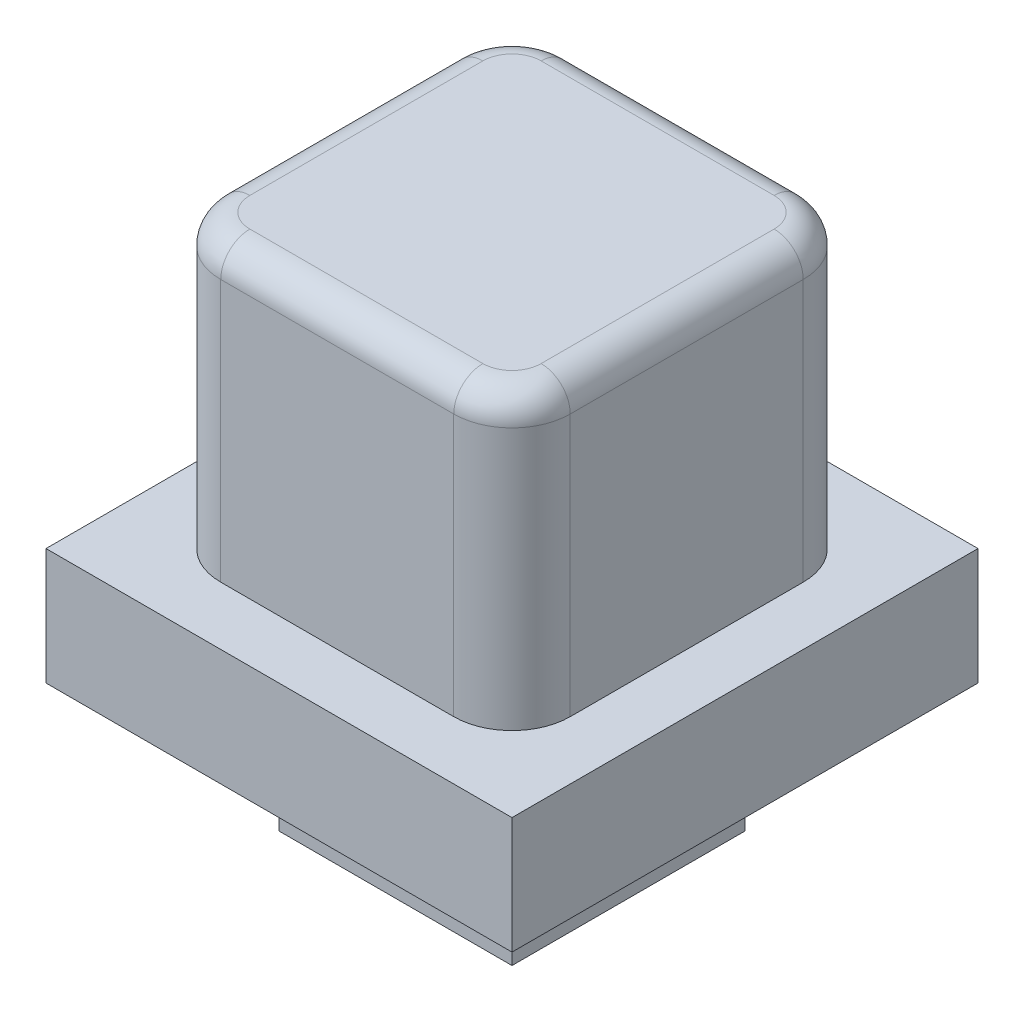
ISO-10303-21;
HEADER;
FILE_DESCRIPTION(('STEP AP214'),'2;1');
FILE_NAME('part.step','',(''),(''),'','','');
FILE_SCHEMA(('AUTOMOTIVE_DESIGN { 1 0 10303 214 1 1 1 1 }'));
ENDSEC;
DATA;
#1=APPLICATION_CONTEXT('core data for automotive mechanical design processes');
#2=APPLICATION_PROTOCOL_DEFINITION('international standard','automotive_design',2000,#1);
#3=PRODUCT_CONTEXT('',#1,'mechanical');
#4=PRODUCT('Part','Part','',(#3));
#5=PRODUCT_RELATED_PRODUCT_CATEGORY('part','',(#4));
#6=PRODUCT_DEFINITION_FORMATION('','',#4);
#7=PRODUCT_DEFINITION_CONTEXT('part definition',#1,'design');
#8=PRODUCT_DEFINITION('design','',#6,#7);
#9=PRODUCT_DEFINITION_SHAPE('','',#8);
#10=(LENGTH_UNIT() NAMED_UNIT(*) SI_UNIT(.MILLI.,.METRE.));
#11=(NAMED_UNIT(*) PLANE_ANGLE_UNIT() SI_UNIT($,.RADIAN.));
#12=(NAMED_UNIT(*) SI_UNIT($,.STERADIAN.) SOLID_ANGLE_UNIT());
#13=UNCERTAINTY_MEASURE_WITH_UNIT(LENGTH_MEASURE(1.E-05),#10,'distance_accuracy_value','');
#14=(GEOMETRIC_REPRESENTATION_CONTEXT(3) GLOBAL_UNCERTAINTY_ASSIGNED_CONTEXT((#13)) GLOBAL_UNIT_ASSIGNED_CONTEXT((#10,
#11,#12)) REPRESENTATION_CONTEXT('',''));
#15=CARTESIAN_POINT('',(0.,0.,0.));
#16=DIRECTION('',(0.,0.,1.));
#17=DIRECTION('',(1.,0.,0.));
#18=AXIS2_PLACEMENT_3D('',#15,#16,#17);
#19=CARTESIAN_POINT('',(0.,2.,0.));
#20=DIRECTION('',(0.,-1.,0.));
#21=DIRECTION('',(0.,0.,-1.));
#22=AXIS2_PLACEMENT_3D('',#19,#20,#21);
#23=PLANE('',#22);
#24=DIRECTION('',(0.,0.,-1.));
#25=VECTOR('',#24,1.);
#26=CARTESIAN_POINT('',(4.,2.,4.));
#27=LINE('',#26,#25);
#28=CARTESIAN_POINT('',(4.,2.,4.));
#29=VERTEX_POINT('',#28);
#30=CARTESIAN_POINT('',(4.,2.,-4.));
#31=VERTEX_POINT('',#30);
#32=EDGE_CURVE('E221',#29,#31,#27,.T.);
#33=ORIENTED_EDGE('',*,*,#32,.T.);
#34=DIRECTION('',(-1.,0.,0.));
#35=VECTOR('',#34,1.);
#36=CARTESIAN_POINT('',(-4.,2.,-4.));
#37=LINE('',#36,#35);
#38=CARTESIAN_POINT('',(-4.,2.,-4.));
#39=VERTEX_POINT('',#38);
#40=EDGE_CURVE('E224',#31,#39,#37,.T.);
#41=ORIENTED_EDGE('',*,*,#40,.T.);
#42=DIRECTION('',(0.,0.,1.));
#43=VECTOR('',#42,1.);
#44=CARTESIAN_POINT('',(-4.,2.,4.));
#45=LINE('',#44,#43);
#46=CARTESIAN_POINT('',(-4.,2.,4.));
#47=VERTEX_POINT('',#46);
#48=EDGE_CURVE('E227',#39,#47,#45,.T.);
#49=ORIENTED_EDGE('',*,*,#48,.T.);
#50=DIRECTION('',(1.,0.,0.));
#51=VECTOR('',#50,1.);
#52=CARTESIAN_POINT('',(-4.,2.,4.));
#53=LINE('',#52,#51);
#54=EDGE_CURVE('E229',#47,#29,#53,.T.);
#55=ORIENTED_EDGE('',*,*,#54,.T.);
#56=EDGE_LOOP('',(#33,#41,#49,#55));
#57=FACE_BOUND('',#56,.T.);
#58=DIRECTION('',(0.,0.,-1.));
#59=VECTOR('',#58,1.);
#60=CARTESIAN_POINT('',(3.,2.,3.));
#61=LINE('',#60,#59);
#62=CARTESIAN_POINT('',(3.,2.,2.));
#63=VERTEX_POINT('',#62);
#64=CARTESIAN_POINT('',(3.,2.,-2.));
#65=VERTEX_POINT('',#64);
#66=EDGE_CURVE('E203',#63,#65,#61,.T.);
#67=ORIENTED_EDGE('',*,*,#66,.F.);
#68=CARTESIAN_POINT('',(2.,2.,2.));
#69=DIRECTION('',(0.,-1.,0.));
#70=DIRECTION('',(0.,0.,-1.));
#71=AXIS2_PLACEMENT_3D('',#68,#69,#70);
#72=CIRCLE('',#71,1.);
#73=CARTESIAN_POINT('',(2.,2.,3.));
#74=VERTEX_POINT('',#73);
#75=EDGE_CURVE('E268',#63,#74,#72,.T.);
#76=ORIENTED_EDGE('',*,*,#75,.T.);
#77=DIRECTION('',(1.,0.,0.));
#78=VECTOR('',#77,1.);
#79=CARTESIAN_POINT('',(-3.,2.,3.));
#80=LINE('',#79,#78);
#81=CARTESIAN_POINT('',(-2.,2.,3.));
#82=VERTEX_POINT('',#81);
#83=EDGE_CURVE('E217',#82,#74,#80,.T.);
#84=ORIENTED_EDGE('',*,*,#83,.F.);
#85=CARTESIAN_POINT('',(-2.,2.,2.));
#86=DIRECTION('',(0.,-1.,0.));
#87=DIRECTION('',(0.,0.,-1.));
#88=AXIS2_PLACEMENT_3D('',#85,#86,#87);
#89=CIRCLE('',#88,1.);
#90=CARTESIAN_POINT('',(-3.,2.,2.));
#91=VERTEX_POINT('',#90);
#92=EDGE_CURVE('E272',#82,#91,#89,.T.);
#93=ORIENTED_EDGE('',*,*,#92,.T.);
#94=DIRECTION('',(0.,0.,1.));
#95=VECTOR('',#94,1.);
#96=CARTESIAN_POINT('',(-3.,2.,3.));
#97=LINE('',#96,#95);
#98=CARTESIAN_POINT('',(-3.,2.,-2.));
#99=VERTEX_POINT('',#98);
#100=EDGE_CURVE('E214',#99,#91,#97,.T.);
#101=ORIENTED_EDGE('',*,*,#100,.F.);
#102=CARTESIAN_POINT('',(-2.,2.,-2.));
#103=DIRECTION('',(0.,-1.,0.));
#104=DIRECTION('',(0.,0.,-1.));
#105=AXIS2_PLACEMENT_3D('',#102,#103,#104);
#106=CIRCLE('',#105,1.);
#107=CARTESIAN_POINT('',(-2.,2.,-3.));
#108=VERTEX_POINT('',#107);
#109=EDGE_CURVE('E274',#99,#108,#106,.T.);
#110=ORIENTED_EDGE('',*,*,#109,.T.);
#111=DIRECTION('',(-1.,0.,0.));
#112=VECTOR('',#111,1.);
#113=CARTESIAN_POINT('',(-3.,2.,-3.));
#114=LINE('',#113,#112);
#115=CARTESIAN_POINT('',(2.,2.,-3.));
#116=VERTEX_POINT('',#115);
#117=EDGE_CURVE('E206',#116,#108,#114,.T.);
#118=ORIENTED_EDGE('',*,*,#117,.F.);
#119=CARTESIAN_POINT('',(2.,2.,-2.));
#120=DIRECTION('',(0.,-1.,0.));
#121=DIRECTION('',(0.,0.,-1.));
#122=AXIS2_PLACEMENT_3D('',#119,#120,#121);
#123=CIRCLE('',#122,1.);
#124=EDGE_CURVE('E270',#116,#65,#123,.T.);
#125=ORIENTED_EDGE('',*,*,#124,.T.);
#126=EDGE_LOOP('',(#67,#76,#84,#93,#101,#110,#118,#125));
#127=FACE_BOUND('',#126,.T.);
#128=ADVANCED_FACE('F39',(#57,#127),#23,.F.);
#129=CARTESIAN_POINT('',(4.,2.,4.));
#130=DIRECTION('',(-1.,0.,0.));
#131=DIRECTION('',(0.,0.,1.));
#132=AXIS2_PLACEMENT_3D('',#129,#130,#131);
#133=PLANE('',#132);
#134=DIRECTION('',(0.,0.,-1.));
#135=VECTOR('',#134,1.);
#136=CARTESIAN_POINT('',(4.,0.,4.));
#137=LINE('',#136,#135);
#138=CARTESIAN_POINT('',(4.,0.,4.));
#139=VERTEX_POINT('',#138);
#140=CARTESIAN_POINT('',(4.,0.,-4.));
#141=VERTEX_POINT('',#140);
#142=EDGE_CURVE('E220',#139,#141,#137,.T.);
#143=ORIENTED_EDGE('',*,*,#142,.T.);
#144=DIRECTION('',(0.,-1.,0.));
#145=VECTOR('',#144,1.);
#146=CARTESIAN_POINT('',(4.,2.,-4.));
#147=LINE('',#146,#145);
#148=EDGE_CURVE('E247',#31,#141,#147,.T.);
#149=ORIENTED_EDGE('',*,*,#148,.F.);
#150=ORIENTED_EDGE('',*,*,#32,.F.);
#151=DIRECTION('',(0.,-1.,0.));
#152=VECTOR('',#151,1.);
#153=CARTESIAN_POINT('',(4.,2.,4.));
#154=LINE('',#153,#152);
#155=EDGE_CURVE('E231',#29,#139,#154,.T.);
#156=ORIENTED_EDGE('',*,*,#155,.T.);
#157=EDGE_LOOP('',(#143,#149,#150,#156));
#158=FACE_BOUND('',#157,.T.);
#159=ADVANCED_FACE('F361',(#158),#133,.F.);
#160=CARTESIAN_POINT('',(-4.,2.,-4.));
#161=DIRECTION('',(0.,0.,1.));
#162=DIRECTION('',(1.,0.,0.));
#163=AXIS2_PLACEMENT_3D('',#160,#161,#162);
#164=PLANE('',#163);
#165=DIRECTION('',(-1.,0.,0.));
#166=VECTOR('',#165,1.);
#167=CARTESIAN_POINT('',(-4.,0.,-4.));
#168=LINE('',#167,#166);
#169=CARTESIAN_POINT('',(-4.,0.,-4.));
#170=VERTEX_POINT('',#169);
#171=EDGE_CURVE('E234',#141,#170,#168,.T.);
#172=ORIENTED_EDGE('',*,*,#171,.T.);
#173=DIRECTION('',(0.,-1.,0.));
#174=VECTOR('',#173,1.);
#175=CARTESIAN_POINT('',(-4.,2.,-4.));
#176=LINE('',#175,#174);
#177=EDGE_CURVE('E244',#39,#170,#176,.T.);
#178=ORIENTED_EDGE('',*,*,#177,.F.);
#179=ORIENTED_EDGE('',*,*,#40,.F.);
#180=ORIENTED_EDGE('',*,*,#148,.T.);
#181=EDGE_LOOP('',(#172,#178,#179,#180));
#182=FACE_BOUND('',#181,.T.);
#183=ADVANCED_FACE('F372',(#182),#164,.F.);
#184=CARTESIAN_POINT('',(-4.,2.,4.));
#185=DIRECTION('',(1.,0.,0.));
#186=DIRECTION('',(0.,0.,-1.));
#187=AXIS2_PLACEMENT_3D('',#184,#185,#186);
#188=PLANE('',#187);
#189=DIRECTION('',(0.,0.,1.));
#190=VECTOR('',#189,1.);
#191=CARTESIAN_POINT('',(-4.,0.,4.));
#192=LINE('',#191,#190);
#193=CARTESIAN_POINT('',(-4.,0.,4.));
#194=VERTEX_POINT('',#193);
#195=EDGE_CURVE('E236',#170,#194,#192,.T.);
#196=ORIENTED_EDGE('',*,*,#195,.T.);
#197=DIRECTION('',(0.,-1.,0.));
#198=VECTOR('',#197,1.);
#199=CARTESIAN_POINT('',(-4.,2.,4.));
#200=LINE('',#199,#198);
#201=EDGE_CURVE('E241',#47,#194,#200,.T.);
#202=ORIENTED_EDGE('',*,*,#201,.F.);
#203=ORIENTED_EDGE('',*,*,#48,.F.);
#204=ORIENTED_EDGE('',*,*,#177,.T.);
#205=EDGE_LOOP('',(#196,#202,#203,#204));
#206=FACE_BOUND('',#205,.T.);
#207=ADVANCED_FACE('F369',(#206),#188,.F.);
#208=CARTESIAN_POINT('',(-4.,2.,4.));
#209=DIRECTION('',(0.,0.,-1.));
#210=DIRECTION('',(-1.,0.,0.));
#211=AXIS2_PLACEMENT_3D('',#208,#209,#210);
#212=PLANE('',#211);
#213=DIRECTION('',(1.,0.,0.));
#214=VECTOR('',#213,1.);
#215=CARTESIAN_POINT('',(-4.,0.,4.));
#216=LINE('',#215,#214);
#217=EDGE_CURVE('E225',#194,#139,#216,.T.);
#218=ORIENTED_EDGE('',*,*,#217,.T.);
#219=ORIENTED_EDGE('',*,*,#155,.F.);
#220=ORIENTED_EDGE('',*,*,#54,.F.);
#221=ORIENTED_EDGE('',*,*,#201,.T.);
#222=EDGE_LOOP('',(#218,#219,#220,#221));
#223=FACE_BOUND('',#222,.T.);
#224=ADVANCED_FACE('F354',(#223),#212,.F.);
#225=CARTESIAN_POINT('',(0.,0.,0.));
#226=DIRECTION('',(0.,-1.,0.));
#227=DIRECTION('',(0.,0.,-1.));
#228=AXIS2_PLACEMENT_3D('',#225,#226,#227);
#229=PLANE('',#228);
#230=DIRECTION('',(0.,0.,-1.));
#231=VECTOR('',#230,1.);
#232=CARTESIAN_POINT('',(-2.,0.,2.));
#233=LINE('',#232,#231);
#234=CARTESIAN_POINT('',(-2.,0.,2.));
#235=VERTEX_POINT('',#234);
#236=CARTESIAN_POINT('',(-2.,0.,-2.));
#237=VERTEX_POINT('',#236);
#238=EDGE_CURVE('E202',#235,#237,#233,.T.);
#239=ORIENTED_EDGE('',*,*,#238,.F.);
#240=DIRECTION('',(-1.,0.,0.));
#241=VECTOR('',#240,1.);
#242=CARTESIAN_POINT('',(2.,0.,2.));
#243=LINE('',#242,#241);
#244=CARTESIAN_POINT('',(2.,0.,2.));
#245=VERTEX_POINT('',#244);
#246=EDGE_CURVE('E199',#245,#235,#243,.T.);
#247=ORIENTED_EDGE('',*,*,#246,.F.);
#248=DIRECTION('',(0.,0.,1.));
#249=VECTOR('',#248,1.);
#250=CARTESIAN_POINT('',(2.,0.,2.));
#251=LINE('',#250,#249);
#252=CARTESIAN_POINT('',(2.,0.,-2.));
#253=VERTEX_POINT('',#252);
#254=EDGE_CURVE('E333',#253,#245,#251,.T.);
#255=ORIENTED_EDGE('',*,*,#254,.F.);
#256=DIRECTION('',(1.,0.,0.));
#257=VECTOR('',#256,1.);
#258=CARTESIAN_POINT('',(2.,0.,-2.));
#259=LINE('',#258,#257);
#260=EDGE_CURVE('E331',#237,#253,#259,.T.);
#261=ORIENTED_EDGE('',*,*,#260,.F.);
#262=EDGE_LOOP('',(#239,#247,#255,#261));
#263=FACE_BOUND('',#262,.T.);
#264=ORIENTED_EDGE('',*,*,#142,.F.);
#265=ORIENTED_EDGE('',*,*,#217,.F.);
#266=ORIENTED_EDGE('',*,*,#195,.F.);
#267=ORIENTED_EDGE('',*,*,#171,.F.);
#268=EDGE_LOOP('',(#264,#265,#266,#267));
#269=FACE_BOUND('',#268,.T.);
#270=ADVANCED_FACE('F350',(#263,#269),#229,.T.);
#271=CARTESIAN_POINT('',(3.,7.,3.));
#272=DIRECTION('',(-1.,0.,0.));
#273=DIRECTION('',(0.,0.,1.));
#274=AXIS2_PLACEMENT_3D('',#271,#272,#273);
#275=PLANE('',#274);
#276=DIRECTION('',(0.,-1.,0.));
#277=VECTOR('',#276,1.);
#278=CARTESIAN_POINT('',(3.,7.,-2.));
#279=LINE('',#278,#277);
#280=CARTESIAN_POINT('',(3.,6.5,-2.));
#281=VERTEX_POINT('',#280);
#282=EDGE_CURVE('E250',#65,#281,#279,.F.);
#283=ORIENTED_EDGE('',*,*,#282,.T.);
#284=DIRECTION('',(0.,0.,-1.));
#285=VECTOR('',#284,1.);
#286=CARTESIAN_POINT('',(3.,6.5,3.));
#287=LINE('',#286,#285);
#288=CARTESIAN_POINT('',(3.,6.5,2.));
#289=VERTEX_POINT('',#288);
#290=EDGE_CURVE('E296',#281,#289,#287,.F.);
#291=ORIENTED_EDGE('',*,*,#290,.T.);
#292=DIRECTION('',(0.,-1.,0.));
#293=VECTOR('',#292,1.);
#294=CARTESIAN_POINT('',(3.,7.,2.));
#295=LINE('',#294,#293);
#296=EDGE_CURVE('E253',#289,#63,#295,.T.);
#297=ORIENTED_EDGE('',*,*,#296,.T.);
#298=ORIENTED_EDGE('',*,*,#66,.T.);
#299=EDGE_LOOP('',(#283,#291,#297,#298));
#300=FACE_BOUND('',#299,.T.);
#301=ADVANCED_FACE('F353',(#300),#275,.F.);
#302=CARTESIAN_POINT('',(-3.,7.,-3.));
#303=DIRECTION('',(0.,0.,1.));
#304=DIRECTION('',(1.,0.,0.));
#305=AXIS2_PLACEMENT_3D('',#302,#303,#304);
#306=PLANE('',#305);
#307=DIRECTION('',(0.,-1.,0.));
#308=VECTOR('',#307,1.);
#309=CARTESIAN_POINT('',(-2.,7.,-3.));
#310=LINE('',#309,#308);
#311=CARTESIAN_POINT('',(-2.,6.5,-3.));
#312=VERTEX_POINT('',#311);
#313=EDGE_CURVE('E260',#108,#312,#310,.F.);
#314=ORIENTED_EDGE('',*,*,#313,.T.);
#315=DIRECTION('',(-1.,0.,0.));
#316=VECTOR('',#315,1.);
#317=CARTESIAN_POINT('',(-3.,6.5,-3.));
#318=LINE('',#317,#316);
#319=CARTESIAN_POINT('',(2.,6.5,-3.));
#320=VERTEX_POINT('',#319);
#321=EDGE_CURVE('E11',#312,#320,#318,.F.);
#322=ORIENTED_EDGE('',*,*,#321,.T.);
#323=DIRECTION('',(0.,-1.,0.));
#324=VECTOR('',#323,1.);
#325=CARTESIAN_POINT('',(2.,7.,-3.));
#326=LINE('',#325,#324);
#327=EDGE_CURVE('E262',#320,#116,#326,.T.);
#328=ORIENTED_EDGE('',*,*,#327,.T.);
#329=ORIENTED_EDGE('',*,*,#117,.T.);
#330=EDGE_LOOP('',(#314,#322,#328,#329));
#331=FACE_BOUND('',#330,.T.);
#332=ADVANCED_FACE('F468',(#331),#306,.F.);
#333=CARTESIAN_POINT('',(-3.,7.,3.));
#334=DIRECTION('',(1.,0.,0.));
#335=DIRECTION('',(0.,0.,-1.));
#336=AXIS2_PLACEMENT_3D('',#333,#334,#335);
#337=PLANE('',#336);
#338=DIRECTION('',(0.,-1.,0.));
#339=VECTOR('',#338,1.);
#340=CARTESIAN_POINT('',(-3.,7.,2.));
#341=LINE('',#340,#339);
#342=CARTESIAN_POINT('',(-3.,6.5,2.));
#343=VERTEX_POINT('',#342);
#344=EDGE_CURVE('E266',#91,#343,#341,.F.);
#345=ORIENTED_EDGE('',*,*,#344,.T.);
#346=DIRECTION('',(0.,0.,1.));
#347=VECTOR('',#346,1.);
#348=CARTESIAN_POINT('',(-3.,6.5,3.));
#349=LINE('',#348,#347);
#350=CARTESIAN_POINT('',(-3.,6.5,-2.));
#351=VERTEX_POINT('',#350);
#352=EDGE_CURVE('E63',#343,#351,#349,.F.);
#353=ORIENTED_EDGE('',*,*,#352,.T.);
#354=DIRECTION('',(0.,-1.,0.));
#355=VECTOR('',#354,1.);
#356=CARTESIAN_POINT('',(-3.,7.,-2.));
#357=LINE('',#356,#355);
#358=EDGE_CURVE('E264',#351,#99,#357,.T.);
#359=ORIENTED_EDGE('',*,*,#358,.T.);
#360=ORIENTED_EDGE('',*,*,#100,.T.);
#361=EDGE_LOOP('',(#345,#353,#359,#360));
#362=FACE_BOUND('',#361,.T.);
#363=ADVANCED_FACE('F465',(#362),#337,.F.);
#364=CARTESIAN_POINT('',(-3.,7.,3.));
#365=DIRECTION('',(0.,0.,-1.));
#366=DIRECTION('',(-1.,0.,0.));
#367=AXIS2_PLACEMENT_3D('',#364,#365,#366);
#368=PLANE('',#367);
#369=DIRECTION('',(0.,-1.,0.));
#370=VECTOR('',#369,1.);
#371=CARTESIAN_POINT('',(2.,7.,3.));
#372=LINE('',#371,#370);
#373=CARTESIAN_POINT('',(2.,6.5,3.));
#374=VERTEX_POINT('',#373);
#375=EDGE_CURVE('E257',#74,#374,#372,.F.);
#376=ORIENTED_EDGE('',*,*,#375,.T.);
#377=DIRECTION('',(1.,0.,0.));
#378=VECTOR('',#377,1.);
#379=CARTESIAN_POINT('',(-3.,6.5,3.));
#380=LINE('',#379,#378);
#381=CARTESIAN_POINT('',(-2.,6.5,3.));
#382=VERTEX_POINT('',#381);
#383=EDGE_CURVE('E300',#374,#382,#380,.F.);
#384=ORIENTED_EDGE('',*,*,#383,.T.);
#385=DIRECTION('',(0.,-1.,0.));
#386=VECTOR('',#385,1.);
#387=CARTESIAN_POINT('',(-2.,7.,3.));
#388=LINE('',#387,#386);
#389=EDGE_CURVE('E255',#382,#82,#388,.T.);
#390=ORIENTED_EDGE('',*,*,#389,.T.);
#391=ORIENTED_EDGE('',*,*,#83,.T.);
#392=EDGE_LOOP('',(#376,#384,#390,#391));
#393=FACE_BOUND('',#392,.T.);
#394=ADVANCED_FACE('F418',(#393),#368,.F.);
#395=CARTESIAN_POINT('',(0.,7.,0.));
#396=DIRECTION('',(0.,-1.,0.));
#397=DIRECTION('',(0.,0.,-1.));
#398=AXIS2_PLACEMENT_3D('',#395,#396,#397);
#399=PLANE('',#398);
#400=DIRECTION('',(0.,0.,-1.));
#401=VECTOR('',#400,1.);
#402=CARTESIAN_POINT('',(2.5,7.,0.));
#403=LINE('',#402,#401);
#404=CARTESIAN_POINT('',(2.5,7.,2.));
#405=VERTEX_POINT('',#404);
#406=CARTESIAN_POINT('',(2.5,7.,-2.));
#407=VERTEX_POINT('',#406);
#408=EDGE_CURVE('E288',#405,#407,#403,.T.);
#409=ORIENTED_EDGE('',*,*,#408,.T.);
#410=CARTESIAN_POINT('',(2.,7.,-2.));
#411=DIRECTION('',(0.,-1.,0.));
#412=DIRECTION('',(0.,0.,-1.));
#413=AXIS2_PLACEMENT_3D('',#410,#411,#412);
#414=CIRCLE('',#413,0.5);
#415=CARTESIAN_POINT('',(2.,7.,-2.5));
#416=VERTEX_POINT('',#415);
#417=EDGE_CURVE('E290',#407,#416,#414,.F.);
#418=ORIENTED_EDGE('',*,*,#417,.T.);
#419=DIRECTION('',(-1.,0.,0.));
#420=VECTOR('',#419,1.);
#421=CARTESIAN_POINT('',(0.,7.,-2.5));
#422=LINE('',#421,#420);
#423=CARTESIAN_POINT('',(-2.,7.,-2.5));
#424=VERTEX_POINT('',#423);
#425=EDGE_CURVE('E276',#416,#424,#422,.T.);
#426=ORIENTED_EDGE('',*,*,#425,.T.);
#427=CARTESIAN_POINT('',(-2.,7.,-2.));
#428=DIRECTION('',(0.,-1.,0.));
#429=DIRECTION('',(0.,0.,-1.));
#430=AXIS2_PLACEMENT_3D('',#427,#428,#429);
#431=CIRCLE('',#430,0.5);
#432=CARTESIAN_POINT('',(-2.5,7.,-2.));
#433=VERTEX_POINT('',#432);
#434=EDGE_CURVE('E278',#424,#433,#431,.F.);
#435=ORIENTED_EDGE('',*,*,#434,.T.);
#436=DIRECTION('',(0.,0.,1.));
#437=VECTOR('',#436,1.);
#438=CARTESIAN_POINT('',(-2.5,7.,0.));
#439=LINE('',#438,#437);
#440=CARTESIAN_POINT('',(-2.5,7.,2.));
#441=VERTEX_POINT('',#440);
#442=EDGE_CURVE('E280',#433,#441,#439,.T.);
#443=ORIENTED_EDGE('',*,*,#442,.T.);
#444=CARTESIAN_POINT('',(-2.,7.,2.));
#445=DIRECTION('',(0.,-1.,0.));
#446=DIRECTION('',(0.,0.,-1.));
#447=AXIS2_PLACEMENT_3D('',#444,#445,#446);
#448=CIRCLE('',#447,0.5);
#449=CARTESIAN_POINT('',(-2.,7.,2.5));
#450=VERTEX_POINT('',#449);
#451=EDGE_CURVE('E282',#441,#450,#448,.F.);
#452=ORIENTED_EDGE('',*,*,#451,.T.);
#453=DIRECTION('',(1.,0.,0.));
#454=VECTOR('',#453,1.);
#455=CARTESIAN_POINT('',(0.,7.,2.5));
#456=LINE('',#455,#454);
#457=CARTESIAN_POINT('',(2.,7.,2.5));
#458=VERTEX_POINT('',#457);
#459=EDGE_CURVE('E284',#450,#458,#456,.T.);
#460=ORIENTED_EDGE('',*,*,#459,.T.);
#461=CARTESIAN_POINT('',(2.,7.,2.));
#462=DIRECTION('',(0.,-1.,0.));
#463=DIRECTION('',(0.,0.,-1.));
#464=AXIS2_PLACEMENT_3D('',#461,#462,#463);
#465=CIRCLE('',#464,0.5);
#466=EDGE_CURVE('E286',#458,#405,#465,.F.);
#467=ORIENTED_EDGE('',*,*,#466,.T.);
#468=EDGE_LOOP('',(#409,#418,#426,#435,#443,#452,#460,#467));
#469=FACE_BOUND('',#468,.T.);
#470=ADVANCED_FACE('F402',(#469),#399,.F.);
#471=CARTESIAN_POINT('',(2.,7.,2.));
#472=DIRECTION('',(0.,-1.,0.));
#473=DIRECTION('',(0.,0.,-1.));
#474=AXIS2_PLACEMENT_3D('',#471,#472,#473);
#475=CYLINDRICAL_SURFACE('',#474,1.);
#476=ORIENTED_EDGE('',*,*,#296,.F.);
#477=CARTESIAN_POINT('',(2.,6.5,2.));
#478=DIRECTION('',(0.,-1.,0.));
#479=DIRECTION('',(0.,0.,-1.));
#480=AXIS2_PLACEMENT_3D('',#477,#478,#479);
#481=CIRCLE('',#480,1.);
#482=EDGE_CURVE('E298',#289,#374,#481,.T.);
#483=ORIENTED_EDGE('',*,*,#482,.T.);
#484=ORIENTED_EDGE('',*,*,#375,.F.);
#485=ORIENTED_EDGE('',*,*,#75,.F.);
#486=EDGE_LOOP('',(#476,#483,#484,#485));
#487=FACE_BOUND('',#486,.T.);
#488=ADVANCED_FACE('F410',(#487),#475,.T.);
#489=CARTESIAN_POINT('',(2.,7.,-2.));
#490=DIRECTION('',(0.,-1.,0.));
#491=DIRECTION('',(0.,0.,-1.));
#492=AXIS2_PLACEMENT_3D('',#489,#490,#491);
#493=CYLINDRICAL_SURFACE('',#492,1.);
#494=ORIENTED_EDGE('',*,*,#327,.F.);
#495=CARTESIAN_POINT('',(2.,6.5,-2.));
#496=DIRECTION('',(0.,-1.,0.));
#497=DIRECTION('',(0.,0.,-1.));
#498=AXIS2_PLACEMENT_3D('',#495,#496,#497);
#499=CIRCLE('',#498,1.);
#500=EDGE_CURVE('E293',#320,#281,#499,.T.);
#501=ORIENTED_EDGE('',*,*,#500,.T.);
#502=ORIENTED_EDGE('',*,*,#282,.F.);
#503=ORIENTED_EDGE('',*,*,#124,.F.);
#504=EDGE_LOOP('',(#494,#501,#502,#503));
#505=FACE_BOUND('',#504,.T.);
#506=ADVANCED_FACE('F387',(#505),#493,.T.);
#507=CARTESIAN_POINT('',(-2.,7.,2.));
#508=DIRECTION('',(0.,-1.,0.));
#509=DIRECTION('',(0.,0.,-1.));
#510=AXIS2_PLACEMENT_3D('',#507,#508,#509);
#511=CYLINDRICAL_SURFACE('',#510,1.);
#512=ORIENTED_EDGE('',*,*,#389,.F.);
#513=CARTESIAN_POINT('',(-2.,6.5,2.));
#514=DIRECTION('',(0.,-1.,0.));
#515=DIRECTION('',(0.,0.,-1.));
#516=AXIS2_PLACEMENT_3D('',#513,#514,#515);
#517=CIRCLE('',#516,1.);
#518=EDGE_CURVE('E302',#382,#343,#517,.T.);
#519=ORIENTED_EDGE('',*,*,#518,.T.);
#520=ORIENTED_EDGE('',*,*,#344,.F.);
#521=ORIENTED_EDGE('',*,*,#92,.F.);
#522=EDGE_LOOP('',(#512,#519,#520,#521));
#523=FACE_BOUND('',#522,.T.);
#524=ADVANCED_FACE('F422',(#523),#511,.T.);
#525=CARTESIAN_POINT('',(-2.,7.,-2.));
#526=DIRECTION('',(0.,-1.,0.));
#527=DIRECTION('',(0.,0.,-1.));
#528=AXIS2_PLACEMENT_3D('',#525,#526,#527);
#529=CYLINDRICAL_SURFACE('',#528,1.);
#530=ORIENTED_EDGE('',*,*,#358,.F.);
#531=CARTESIAN_POINT('',(-2.,6.5,-2.));
#532=DIRECTION('',(0.,-1.,0.));
#533=DIRECTION('',(0.,0.,-1.));
#534=AXIS2_PLACEMENT_3D('',#531,#532,#533);
#535=CIRCLE('',#534,1.);
#536=EDGE_CURVE('E48',#351,#312,#535,.T.);
#537=ORIENTED_EDGE('',*,*,#536,.T.);
#538=ORIENTED_EDGE('',*,*,#313,.F.);
#539=ORIENTED_EDGE('',*,*,#109,.F.);
#540=EDGE_LOOP('',(#530,#537,#538,#539));
#541=FACE_BOUND('',#540,.T.);
#542=ADVANCED_FACE('F460',(#541),#529,.T.);
#543=CARTESIAN_POINT('',(-2.,-2.2,2.));
#544=DIRECTION('',(1.,0.,0.));
#545=DIRECTION('',(0.,0.,-1.));
#546=AXIS2_PLACEMENT_3D('',#543,#544,#545);
#547=PLANE('',#546);
#548=ORIENTED_EDGE('',*,*,#238,.T.);
#549=DIRECTION('',(0.,1.,0.));
#550=VECTOR('',#549,1.);
#551=CARTESIAN_POINT('',(-2.,-2.2,-2.));
#552=LINE('',#551,#550);
#553=CARTESIAN_POINT('',(-2.,-2.2,-2.));
#554=VERTEX_POINT('',#553);
#555=EDGE_CURVE('E183',#554,#237,#552,.T.);
#556=ORIENTED_EDGE('',*,*,#555,.F.);
#557=DIRECTION('',(0.,0.,-1.));
#558=VECTOR('',#557,1.);
#559=CARTESIAN_POINT('',(-2.,-2.2,2.));
#560=LINE('',#559,#558);
#561=CARTESIAN_POINT('',(-2.,-2.2,2.));
#562=VERTEX_POINT('',#561);
#563=EDGE_CURVE('E190',#562,#554,#560,.T.);
#564=ORIENTED_EDGE('',*,*,#563,.F.);
#565=DIRECTION('',(0.,1.,0.));
#566=VECTOR('',#565,1.);
#567=CARTESIAN_POINT('',(-2.,-2.2,2.));
#568=LINE('',#567,#566);
#569=EDGE_CURVE('E342',#562,#235,#568,.T.);
#570=ORIENTED_EDGE('',*,*,#569,.T.);
#571=EDGE_LOOP('',(#548,#556,#564,#570));
#572=FACE_BOUND('',#571,.T.);
#573=ADVANCED_FACE('F201',(#572),#547,.F.);
#574=CARTESIAN_POINT('',(2.,-2.2,-2.));
#575=DIRECTION('',(0.,0.,1.));
#576=DIRECTION('',(1.,0.,0.));
#577=AXIS2_PLACEMENT_3D('',#574,#575,#576);
#578=PLANE('',#577);
#579=ORIENTED_EDGE('',*,*,#260,.T.);
#580=DIRECTION('',(0.,1.,0.));
#581=VECTOR('',#580,1.);
#582=CARTESIAN_POINT('',(2.,-2.2,-2.));
#583=LINE('',#582,#581);
#584=CARTESIAN_POINT('',(2.,-2.2,-2.));
#585=VERTEX_POINT('',#584);
#586=EDGE_CURVE('E186',#585,#253,#583,.T.);
#587=ORIENTED_EDGE('',*,*,#586,.F.);
#588=DIRECTION('',(1.,0.,0.));
#589=VECTOR('',#588,1.);
#590=CARTESIAN_POINT('',(2.,-2.2,-2.));
#591=LINE('',#590,#589);
#592=EDGE_CURVE('E178',#554,#585,#591,.T.);
#593=ORIENTED_EDGE('',*,*,#592,.F.);
#594=ORIENTED_EDGE('',*,*,#555,.T.);
#595=EDGE_LOOP('',(#579,#587,#593,#594));
#596=FACE_BOUND('',#595,.T.);
#597=ADVANCED_FACE('F181',(#596),#578,.F.);
#598=CARTESIAN_POINT('',(2.,-2.2,2.));
#599=DIRECTION('',(-1.,0.,0.));
#600=DIRECTION('',(0.,0.,1.));
#601=AXIS2_PLACEMENT_3D('',#598,#599,#600);
#602=PLANE('',#601);
#603=ORIENTED_EDGE('',*,*,#254,.T.);
#604=DIRECTION('',(0.,1.,0.));
#605=VECTOR('',#604,1.);
#606=CARTESIAN_POINT('',(2.,-2.2,2.));
#607=LINE('',#606,#605);
#608=CARTESIAN_POINT('',(2.,-2.2,2.));
#609=VERTEX_POINT('',#608);
#610=EDGE_CURVE('E208',#609,#245,#607,.T.);
#611=ORIENTED_EDGE('',*,*,#610,.F.);
#612=DIRECTION('',(0.,0.,1.));
#613=VECTOR('',#612,1.);
#614=CARTESIAN_POINT('',(2.,-2.2,2.));
#615=LINE('',#614,#613);
#616=EDGE_CURVE('E189',#585,#609,#615,.T.);
#617=ORIENTED_EDGE('',*,*,#616,.F.);
#618=ORIENTED_EDGE('',*,*,#586,.T.);
#619=EDGE_LOOP('',(#603,#611,#617,#618));
#620=FACE_BOUND('',#619,.T.);
#621=ADVANCED_FACE('F348',(#620),#602,.F.);
#622=CARTESIAN_POINT('',(2.,-2.2,2.));
#623=DIRECTION('',(0.,0.,-1.));
#624=DIRECTION('',(-1.,0.,0.));
#625=AXIS2_PLACEMENT_3D('',#622,#623,#624);
#626=PLANE('',#625);
#627=ORIENTED_EDGE('',*,*,#246,.T.);
#628=ORIENTED_EDGE('',*,*,#569,.F.);
#629=DIRECTION('',(-1.,0.,0.));
#630=VECTOR('',#629,1.);
#631=CARTESIAN_POINT('',(2.,-2.2,2.));
#632=LINE('',#631,#630);
#633=EDGE_CURVE('E195',#609,#562,#632,.T.);
#634=ORIENTED_EDGE('',*,*,#633,.F.);
#635=ORIENTED_EDGE('',*,*,#610,.T.);
#636=EDGE_LOOP('',(#627,#628,#634,#635));
#637=FACE_BOUND('',#636,.T.);
#638=ADVANCED_FACE('F346',(#637),#626,.F.);
#639=CARTESIAN_POINT('',(0.,-2.2,0.));
#640=DIRECTION('',(0.,1.,0.));
#641=DIRECTION('',(0.,0.,1.));
#642=AXIS2_PLACEMENT_3D('',#639,#640,#641);
#643=PLANE('',#642);
#644=ORIENTED_EDGE('',*,*,#563,.T.);
#645=ORIENTED_EDGE('',*,*,#592,.T.);
#646=ORIENTED_EDGE('',*,*,#616,.T.);
#647=ORIENTED_EDGE('',*,*,#633,.T.);
#648=EDGE_LOOP('',(#644,#645,#646,#647));
#649=FACE_BOUND('',#648,.T.);
#650=ADVANCED_FACE('F193',(#649),#643,.F.);
#651=CARTESIAN_POINT('',(-2.,6.5,2.));
#652=DIRECTION('',(0.,-1.,0.));
#653=DIRECTION('',(0.,0.,-1.));
#654=AXIS2_PLACEMENT_3D('',#651,#652,#653);
#655=DEGENERATE_TOROIDAL_SURFACE('',#654,0.5,0.5,.T.);
#656=CARTESIAN_POINT('',(-2.5,6.5,2.));
#657=DIRECTION('',(0.,0.,-1.));
#658=DIRECTION('',(-1.,0.,0.));
#659=AXIS2_PLACEMENT_3D('',#656,#657,#658);
#660=CIRCLE('',#659,0.5);
#661=EDGE_CURVE('E321',#343,#441,#660,.T.);
#662=ORIENTED_EDGE('',*,*,#661,.F.);
#663=ORIENTED_EDGE('',*,*,#518,.F.);
#664=CARTESIAN_POINT('',(-2.,6.5,2.5));
#665=DIRECTION('',(1.,0.,0.));
#666=DIRECTION('',(0.,0.,-1.));
#667=AXIS2_PLACEMENT_3D('',#664,#665,#666);
#668=CIRCLE('',#667,0.5);
#669=EDGE_CURVE('E43',#450,#382,#668,.T.);
#670=ORIENTED_EDGE('',*,*,#669,.F.);
#671=ORIENTED_EDGE('',*,*,#451,.F.);
#672=EDGE_LOOP('',(#662,#663,#670,#671));
#673=FACE_BOUND('',#672,.T.);
#674=ADVANCED_FACE('F41',(#673),#655,.T.);
#675=CARTESIAN_POINT('',(0.,6.5,2.5));
#676=DIRECTION('',(1.,0.,0.));
#677=DIRECTION('',(0.,0.,-1.));
#678=AXIS2_PLACEMENT_3D('',#675,#676,#677);
#679=CYLINDRICAL_SURFACE('',#678,0.5);
#680=ORIENTED_EDGE('',*,*,#669,.T.);
#681=ORIENTED_EDGE('',*,*,#383,.F.);
#682=CARTESIAN_POINT('',(2.,6.5,2.5));
#683=DIRECTION('',(1.,0.,0.));
#684=DIRECTION('',(0.,0.,-1.));
#685=AXIS2_PLACEMENT_3D('',#682,#683,#684);
#686=CIRCLE('',#685,0.5);
#687=EDGE_CURVE('E319',#458,#374,#686,.T.);
#688=ORIENTED_EDGE('',*,*,#687,.F.);
#689=ORIENTED_EDGE('',*,*,#459,.F.);
#690=EDGE_LOOP('',(#680,#681,#688,#689));
#691=FACE_BOUND('',#690,.T.);
#692=ADVANCED_FACE('F415',(#691),#679,.T.);
#693=CARTESIAN_POINT('',(-2.5,6.5,0.));
#694=DIRECTION('',(0.,0.,1.));
#695=DIRECTION('',(1.,0.,0.));
#696=AXIS2_PLACEMENT_3D('',#693,#694,#695);
#697=CYLINDRICAL_SURFACE('',#696,0.5);
#698=ORIENTED_EDGE('',*,*,#661,.T.);
#699=ORIENTED_EDGE('',*,*,#442,.F.);
#700=CARTESIAN_POINT('',(-2.5,6.5,-2.));
#701=DIRECTION('',(0.,0.,-1.));
#702=DIRECTION('',(-1.,0.,0.));
#703=AXIS2_PLACEMENT_3D('',#700,#701,#702);
#704=CIRCLE('',#703,0.5);
#705=EDGE_CURVE('E316',#351,#433,#704,.T.);
#706=ORIENTED_EDGE('',*,*,#705,.F.);
#707=ORIENTED_EDGE('',*,*,#352,.F.);
#708=EDGE_LOOP('',(#698,#699,#706,#707));
#709=FACE_BOUND('',#708,.T.);
#710=ADVANCED_FACE('F427',(#709),#697,.T.);
#711=CARTESIAN_POINT('',(2.,6.5,2.));
#712=DIRECTION('',(0.,-1.,0.));
#713=DIRECTION('',(0.,0.,-1.));
#714=AXIS2_PLACEMENT_3D('',#711,#712,#713);
#715=DEGENERATE_TOROIDAL_SURFACE('',#714,0.5,0.5,.T.);
#716=ORIENTED_EDGE('',*,*,#687,.T.);
#717=ORIENTED_EDGE('',*,*,#482,.F.);
#718=CARTESIAN_POINT('',(2.5,6.5,2.));
#719=DIRECTION('',(0.,0.,-1.));
#720=DIRECTION('',(-1.,0.,0.));
#721=AXIS2_PLACEMENT_3D('',#718,#719,#720);
#722=CIRCLE('',#721,0.5);
#723=EDGE_CURVE('E313',#405,#289,#722,.T.);
#724=ORIENTED_EDGE('',*,*,#723,.F.);
#725=ORIENTED_EDGE('',*,*,#466,.F.);
#726=EDGE_LOOP('',(#716,#717,#724,#725));
#727=FACE_BOUND('',#726,.T.);
#728=ADVANCED_FACE('F413',(#727),#715,.T.);
#729=CARTESIAN_POINT('',(-2.,6.5,-2.));
#730=DIRECTION('',(0.,-1.,0.));
#731=DIRECTION('',(0.,0.,-1.));
#732=AXIS2_PLACEMENT_3D('',#729,#730,#731);
#733=DEGENERATE_TOROIDAL_SURFACE('',#732,0.5,0.5,.T.);
#734=ORIENTED_EDGE('',*,*,#705,.T.);
#735=ORIENTED_EDGE('',*,*,#434,.F.);
#736=CARTESIAN_POINT('',(-2.,6.5,-2.5));
#737=DIRECTION('',(1.,0.,0.));
#738=DIRECTION('',(0.,0.,-1.));
#739=AXIS2_PLACEMENT_3D('',#736,#737,#738);
#740=CIRCLE('',#739,0.5);
#741=EDGE_CURVE('E310',#312,#424,#740,.T.);
#742=ORIENTED_EDGE('',*,*,#741,.F.);
#743=ORIENTED_EDGE('',*,*,#536,.F.);
#744=EDGE_LOOP('',(#734,#735,#742,#743));
#745=FACE_BOUND('',#744,.T.);
#746=ADVANCED_FACE('F429',(#745),#733,.T.);
#747=CARTESIAN_POINT('',(2.5,6.5,0.));
#748=DIRECTION('',(0.,0.,-1.));
#749=DIRECTION('',(-1.,0.,0.));
#750=AXIS2_PLACEMENT_3D('',#747,#748,#749);
#751=CYLINDRICAL_SURFACE('',#750,0.5);
#752=ORIENTED_EDGE('',*,*,#723,.T.);
#753=ORIENTED_EDGE('',*,*,#290,.F.);
#754=CARTESIAN_POINT('',(2.5,6.5,-2.));
#755=DIRECTION('',(0.,0.,-1.));
#756=DIRECTION('',(-1.,0.,0.));
#757=AXIS2_PLACEMENT_3D('',#754,#755,#756);
#758=CIRCLE('',#757,0.5);
#759=EDGE_CURVE('E308',#407,#281,#758,.T.);
#760=ORIENTED_EDGE('',*,*,#759,.F.);
#761=ORIENTED_EDGE('',*,*,#408,.F.);
#762=EDGE_LOOP('',(#752,#753,#760,#761));
#763=FACE_BOUND('',#762,.T.);
#764=ADVANCED_FACE('F407',(#763),#751,.T.);
#765=CARTESIAN_POINT('',(0.,6.5,-2.5));
#766=DIRECTION('',(-1.,0.,0.));
#767=DIRECTION('',(0.,0.,1.));
#768=AXIS2_PLACEMENT_3D('',#765,#766,#767);
#769=CYLINDRICAL_SURFACE('',#768,0.5);
#770=ORIENTED_EDGE('',*,*,#741,.T.);
#771=ORIENTED_EDGE('',*,*,#425,.F.);
#772=CARTESIAN_POINT('',(2.,6.5,-2.5));
#773=DIRECTION('',(1.,0.,0.));
#774=DIRECTION('',(0.,0.,-1.));
#775=AXIS2_PLACEMENT_3D('',#772,#773,#774);
#776=CIRCLE('',#775,0.5);
#777=EDGE_CURVE('E306',#320,#416,#776,.T.);
#778=ORIENTED_EDGE('',*,*,#777,.F.);
#779=ORIENTED_EDGE('',*,*,#321,.F.);
#780=EDGE_LOOP('',(#770,#771,#778,#779));
#781=FACE_BOUND('',#780,.T.);
#782=ADVANCED_FACE('F398',(#781),#769,.T.);
#783=CARTESIAN_POINT('',(2.,6.5,-2.));
#784=DIRECTION('',(0.,-1.,0.));
#785=DIRECTION('',(0.,0.,-1.));
#786=AXIS2_PLACEMENT_3D('',#783,#784,#785);
#787=DEGENERATE_TOROIDAL_SURFACE('',#786,0.5,0.5,.T.);
#788=ORIENTED_EDGE('',*,*,#759,.T.);
#789=ORIENTED_EDGE('',*,*,#500,.F.);
#790=ORIENTED_EDGE('',*,*,#777,.T.);
#791=ORIENTED_EDGE('',*,*,#417,.F.);
#792=EDGE_LOOP('',(#788,#789,#790,#791));
#793=FACE_BOUND('',#792,.T.);
#794=ADVANCED_FACE('F391',(#793),#787,.T.);
#795=CLOSED_SHELL('',(#128,#159,#183,#207,#224,#270,#301,#332,#363,#394,#470,#488,#506,#524,
#542,#573,#597,#621,#638,#650,#674,#692,#710,#728,#746,#764,#782,#794));
#796=MANIFOLD_SOLID_BREP('B2',#795);
#797=ADVANCED_BREP_SHAPE_REPRESENTATION('',(#18,#796),#14);
#798=SHAPE_DEFINITION_REPRESENTATION(#9,#797);
ENDSEC;
END-ISO-10303-21;
